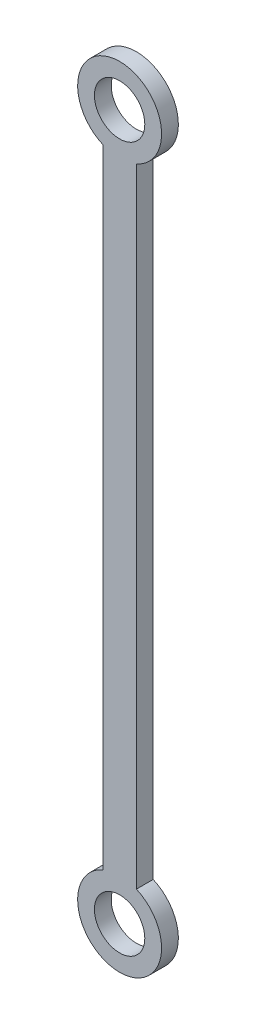
ISO-10303-21;
HEADER;
FILE_DESCRIPTION(('STEP AP214'),'2;1');
FILE_NAME('part.step','',(''),(''),'','','');
FILE_SCHEMA(('AUTOMOTIVE_DESIGN { 1 0 10303 214 1 1 1 1 }'));
ENDSEC;
DATA;
#1=APPLICATION_CONTEXT('core data for automotive mechanical design processes');
#2=APPLICATION_PROTOCOL_DEFINITION('international standard','automotive_design',2000,#1);
#3=PRODUCT_CONTEXT('',#1,'mechanical');
#4=PRODUCT('Part','Part','',(#3));
#5=PRODUCT_RELATED_PRODUCT_CATEGORY('part','',(#4));
#6=PRODUCT_DEFINITION_FORMATION('','',#4);
#7=PRODUCT_DEFINITION_CONTEXT('part definition',#1,'design');
#8=PRODUCT_DEFINITION('design','',#6,#7);
#9=PRODUCT_DEFINITION_SHAPE('','',#8);
#10=(LENGTH_UNIT() NAMED_UNIT(*) SI_UNIT(.MILLI.,.METRE.));
#11=(NAMED_UNIT(*) PLANE_ANGLE_UNIT() SI_UNIT($,.RADIAN.));
#12=(NAMED_UNIT(*) SI_UNIT($,.STERADIAN.) SOLID_ANGLE_UNIT());
#13=UNCERTAINTY_MEASURE_WITH_UNIT(LENGTH_MEASURE(1.E-05),#10,'distance_accuracy_value','');
#14=(GEOMETRIC_REPRESENTATION_CONTEXT(3) GLOBAL_UNCERTAINTY_ASSIGNED_CONTEXT((#13)) GLOBAL_UNIT_ASSIGNED_CONTEXT((#10,
#11,#12)) REPRESENTATION_CONTEXT('',''));
#15=CARTESIAN_POINT('',(0.,0.,0.));
#16=DIRECTION('',(0.,0.,1.));
#17=DIRECTION('',(1.,0.,0.));
#18=AXIS2_PLACEMENT_3D('',#15,#16,#17);
#19=CARTESIAN_POINT('',(0.,420.,10.));
#20=DIRECTION('',(0.,0.,-1.));
#21=DIRECTION('',(-1.,0.,0.));
#22=AXIS2_PLACEMENT_3D('',#19,#20,#21);
#23=PLANE('',#22);
#24=CARTESIAN_POINT('',(0.,0.,10.));
#25=DIRECTION('',(0.,0.,1.));
#26=DIRECTION('',(1.,0.,0.));
#27=AXIS2_PLACEMENT_3D('',#24,#25,#26);
#28=CIRCLE('',#27,15.);
#29=CARTESIAN_POINT('',(15.,0.,10.));
#30=VERTEX_POINT('',#29);
#31=EDGE_CURVE('E100',#30,#30,#28,.T.);
#32=ORIENTED_EDGE('',*,*,#31,.F.);
#33=EDGE_LOOP('',(#32));
#34=FACE_BOUND('',#33,.T.);
#35=CARTESIAN_POINT('',(0.,420.,10.));
#36=DIRECTION('',(0.,0.,1.));
#37=DIRECTION('',(-1.,0.,0.));
#38=AXIS2_PLACEMENT_3D('',#35,#36,#37);
#39=CIRCLE('',#38,25.);
#40=CARTESIAN_POINT('',(9.99999999999997,397.087121525221,10.));
#41=VERTEX_POINT('',#40);
#42=CARTESIAN_POINT('',(-10.,397.087121525221,10.));
#43=VERTEX_POINT('',#42);
#44=EDGE_CURVE('E85',#41,#43,#39,.T.);
#45=ORIENTED_EDGE('',*,*,#44,.T.);
#46=DIRECTION('',(0.,-1.,0.));
#47=VECTOR('',#46,1.);
#48=CARTESIAN_POINT('',(-10.,397.087121525221,10.));
#49=LINE('',#48,#47);
#50=CARTESIAN_POINT('',(-9.99999999999998,22.9128784747792,10.));
#51=VERTEX_POINT('',#50);
#52=EDGE_CURVE('E80',#43,#51,#49,.T.);
#53=ORIENTED_EDGE('',*,*,#52,.T.);
#54=CARTESIAN_POINT('',(0.,0.,10.));
#55=DIRECTION('',(0.,0.,1.));
#56=DIRECTION('',(1.,0.,0.));
#57=AXIS2_PLACEMENT_3D('',#54,#55,#56);
#58=CIRCLE('',#57,25.);
#59=CARTESIAN_POINT('',(9.99999999999998,22.9128784747792,10.));
#60=VERTEX_POINT('',#59);
#61=EDGE_CURVE('E83',#51,#60,#58,.T.);
#62=ORIENTED_EDGE('',*,*,#61,.T.);
#63=DIRECTION('',(0.,1.,0.));
#64=VECTOR('',#63,1.);
#65=CARTESIAN_POINT('',(9.99999999999997,397.087121525221,10.));
#66=LINE('',#65,#64);
#67=EDGE_CURVE('E50',#60,#41,#66,.T.);
#68=ORIENTED_EDGE('',*,*,#67,.T.);
#69=EDGE_LOOP('',(#45,#53,#62,#68));
#70=FACE_BOUND('',#69,.T.);
#71=CARTESIAN_POINT('',(0.,420.,10.));
#72=DIRECTION('',(0.,0.,1.));
#73=DIRECTION('',(1.,0.,0.));
#74=AXIS2_PLACEMENT_3D('',#71,#72,#73);
#75=CIRCLE('',#74,15.);
#76=CARTESIAN_POINT('',(15.,420.,10.));
#77=VERTEX_POINT('',#76);
#78=EDGE_CURVE('E115',#77,#77,#75,.T.);
#79=ORIENTED_EDGE('',*,*,#78,.F.);
#80=EDGE_LOOP('',(#79));
#81=FACE_BOUND('',#80,.T.);
#82=ADVANCED_FACE('F33',(#34,#70,#81),#23,.F.);
#83=CARTESIAN_POINT('',(0.,420.,0.));
#84=DIRECTION('',(0.,0.,-1.));
#85=DIRECTION('',(-1.,0.,0.));
#86=AXIS2_PLACEMENT_3D('',#83,#84,#85);
#87=PLANE('',#86);
#88=CARTESIAN_POINT('',(0.,0.,0.));
#89=DIRECTION('',(0.,0.,1.));
#90=DIRECTION('',(1.,0.,0.));
#91=AXIS2_PLACEMENT_3D('',#88,#89,#90);
#92=CIRCLE('',#91,15.);
#93=CARTESIAN_POINT('',(15.,0.,0.));
#94=VERTEX_POINT('',#93);
#95=EDGE_CURVE('E112',#94,#94,#92,.T.);
#96=ORIENTED_EDGE('',*,*,#95,.T.);
#97=EDGE_LOOP('',(#96));
#98=FACE_BOUND('',#97,.T.);
#99=CARTESIAN_POINT('',(0.,420.,0.));
#100=DIRECTION('',(0.,0.,1.));
#101=DIRECTION('',(-1.,0.,0.));
#102=AXIS2_PLACEMENT_3D('',#99,#100,#101);
#103=CIRCLE('',#102,25.);
#104=CARTESIAN_POINT('',(9.99999999999997,397.087121525221,0.));
#105=VERTEX_POINT('',#104);
#106=CARTESIAN_POINT('',(-10.,397.087121525221,0.));
#107=VERTEX_POINT('',#106);
#108=EDGE_CURVE('E97',#105,#107,#103,.T.);
#109=ORIENTED_EDGE('',*,*,#108,.F.);
#110=DIRECTION('',(0.,1.,0.));
#111=VECTOR('',#110,1.);
#112=CARTESIAN_POINT('',(9.99999999999997,397.087121525221,0.));
#113=LINE('',#112,#111);
#114=CARTESIAN_POINT('',(9.99999999999998,22.9128784747792,0.));
#115=VERTEX_POINT('',#114);
#116=EDGE_CURVE('E73',#115,#105,#113,.T.);
#117=ORIENTED_EDGE('',*,*,#116,.F.);
#118=CARTESIAN_POINT('',(0.,0.,0.));
#119=DIRECTION('',(0.,0.,1.));
#120=DIRECTION('',(1.,0.,0.));
#121=AXIS2_PLACEMENT_3D('',#118,#119,#120);
#122=CIRCLE('',#121,25.);
#123=CARTESIAN_POINT('',(-9.99999999999998,22.9128784747792,0.));
#124=VERTEX_POINT('',#123);
#125=EDGE_CURVE('E67',#124,#115,#122,.T.);
#126=ORIENTED_EDGE('',*,*,#125,.F.);
#127=DIRECTION('',(0.,-1.,0.));
#128=VECTOR('',#127,1.);
#129=CARTESIAN_POINT('',(-10.,397.087121525221,0.));
#130=LINE('',#129,#128);
#131=EDGE_CURVE('E89',#107,#124,#130,.T.);
#132=ORIENTED_EDGE('',*,*,#131,.F.);
#133=EDGE_LOOP('',(#109,#117,#126,#132));
#134=FACE_BOUND('',#133,.T.);
#135=CARTESIAN_POINT('',(0.,420.,0.));
#136=DIRECTION('',(0.,0.,1.));
#137=DIRECTION('',(1.,0.,0.));
#138=AXIS2_PLACEMENT_3D('',#135,#136,#137);
#139=CIRCLE('',#138,15.);
#140=CARTESIAN_POINT('',(15.,420.,0.));
#141=VERTEX_POINT('',#140);
#142=EDGE_CURVE('E118',#141,#141,#139,.T.);
#143=ORIENTED_EDGE('',*,*,#142,.T.);
#144=EDGE_LOOP('',(#143));
#145=FACE_BOUND('',#144,.T.);
#146=ADVANCED_FACE('F108',(#98,#134,#145),#87,.T.);
#147=CARTESIAN_POINT('',(0.,420.,10.));
#148=DIRECTION('',(0.,0.,-1.));
#149=DIRECTION('',(-1.,0.,0.));
#150=AXIS2_PLACEMENT_3D('',#147,#148,#149);
#151=CYLINDRICAL_SURFACE('',#150,25.);
#152=ORIENTED_EDGE('',*,*,#108,.T.);
#153=DIRECTION('',(0.,0.,-1.));
#154=VECTOR('',#153,1.);
#155=CARTESIAN_POINT('',(-10.,397.087121525221,10.));
#156=LINE('',#155,#154);
#157=EDGE_CURVE('E11',#43,#107,#156,.T.);
#158=ORIENTED_EDGE('',*,*,#157,.F.);
#159=ORIENTED_EDGE('',*,*,#44,.F.);
#160=DIRECTION('',(0.,0.,-1.));
#161=VECTOR('',#160,1.);
#162=CARTESIAN_POINT('',(9.99999999999997,397.087121525221,10.));
#163=LINE('',#162,#161);
#164=EDGE_CURVE('E93',#41,#105,#163,.T.);
#165=ORIENTED_EDGE('',*,*,#164,.T.);
#166=EDGE_LOOP('',(#152,#158,#159,#165));
#167=FACE_BOUND('',#166,.T.);
#168=ADVANCED_FACE('F35',(#167),#151,.T.);
#169=CARTESIAN_POINT('',(-10.,397.087121525221,10.));
#170=DIRECTION('',(1.,0.,0.));
#171=DIRECTION('',(0.,1.,0.));
#172=AXIS2_PLACEMENT_3D('',#169,#170,#171);
#173=PLANE('',#172);
#174=ORIENTED_EDGE('',*,*,#131,.T.);
#175=DIRECTION('',(0.,0.,-1.));
#176=VECTOR('',#175,1.);
#177=CARTESIAN_POINT('',(-9.99999999999998,22.9128784747792,10.));
#178=LINE('',#177,#176);
#179=EDGE_CURVE('E42',#51,#124,#178,.T.);
#180=ORIENTED_EDGE('',*,*,#179,.F.);
#181=ORIENTED_EDGE('',*,*,#52,.F.);
#182=ORIENTED_EDGE('',*,*,#157,.T.);
#183=EDGE_LOOP('',(#174,#180,#181,#182));
#184=FACE_BOUND('',#183,.T.);
#185=ADVANCED_FACE('F88',(#184),#173,.F.);
#186=CARTESIAN_POINT('',(0.,0.,10.));
#187=DIRECTION('',(0.,0.,-1.));
#188=DIRECTION('',(-1.,0.,0.));
#189=AXIS2_PLACEMENT_3D('',#186,#187,#188);
#190=CYLINDRICAL_SURFACE('',#189,25.);
#191=ORIENTED_EDGE('',*,*,#125,.T.);
#192=DIRECTION('',(0.,0.,-1.));
#193=VECTOR('',#192,1.);
#194=CARTESIAN_POINT('',(9.99999999999998,22.9128784747792,10.));
#195=LINE('',#194,#193);
#196=EDGE_CURVE('E90',#60,#115,#195,.T.);
#197=ORIENTED_EDGE('',*,*,#196,.F.);
#198=ORIENTED_EDGE('',*,*,#61,.F.);
#199=ORIENTED_EDGE('',*,*,#179,.T.);
#200=EDGE_LOOP('',(#191,#197,#198,#199));
#201=FACE_BOUND('',#200,.T.);
#202=ADVANCED_FACE('F91',(#201),#190,.T.);
#203=CARTESIAN_POINT('',(9.99999999999997,397.087121525221,10.));
#204=DIRECTION('',(-1.,0.,0.));
#205=DIRECTION('',(0.,-1.,0.));
#206=AXIS2_PLACEMENT_3D('',#203,#204,#205);
#207=PLANE('',#206);
#208=ORIENTED_EDGE('',*,*,#116,.T.);
#209=ORIENTED_EDGE('',*,*,#164,.F.);
#210=ORIENTED_EDGE('',*,*,#67,.F.);
#211=ORIENTED_EDGE('',*,*,#196,.T.);
#212=EDGE_LOOP('',(#208,#209,#210,#211));
#213=FACE_BOUND('',#212,.T.);
#214=ADVANCED_FACE('F105',(#213),#207,.F.);
#215=CARTESIAN_POINT('',(0.,0.,10.));
#216=DIRECTION('',(0.,0.,-1.));
#217=DIRECTION('',(-1.,0.,0.));
#218=AXIS2_PLACEMENT_3D('',#215,#216,#217);
#219=CYLINDRICAL_SURFACE('',#218,15.);
#220=ORIENTED_EDGE('',*,*,#31,.T.);
#221=EDGE_LOOP('',(#220));
#222=FACE_BOUND('',#221,.T.);
#223=ORIENTED_EDGE('',*,*,#95,.F.);
#224=EDGE_LOOP('',(#223));
#225=FACE_BOUND('',#224,.T.);
#226=ADVANCED_FACE('F136',(#222,#225),#219,.F.);
#227=CARTESIAN_POINT('',(0.,420.,10.));
#228=DIRECTION('',(0.,0.,-1.));
#229=DIRECTION('',(-1.,0.,0.));
#230=AXIS2_PLACEMENT_3D('',#227,#228,#229);
#231=CYLINDRICAL_SURFACE('',#230,15.);
#232=ORIENTED_EDGE('',*,*,#78,.T.);
#233=EDGE_LOOP('',(#232));
#234=FACE_BOUND('',#233,.T.);
#235=ORIENTED_EDGE('',*,*,#142,.F.);
#236=EDGE_LOOP('',(#235));
#237=FACE_BOUND('',#236,.T.);
#238=ADVANCED_FACE('F124',(#234,#237),#231,.F.);
#239=CLOSED_SHELL('',(#82,#146,#168,#185,#202,#214,#226,#238));
#240=MANIFOLD_SOLID_BREP('B2',#239);
#241=ADVANCED_BREP_SHAPE_REPRESENTATION('',(#18,#240),#14);
#242=SHAPE_DEFINITION_REPRESENTATION(#9,#241);
ENDSEC;
END-ISO-10303-21;
